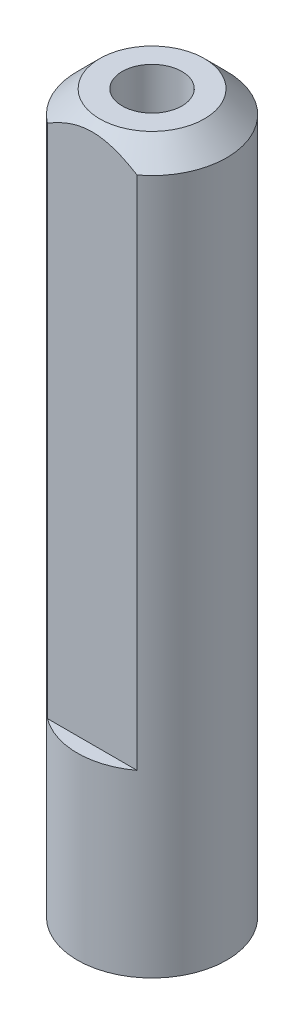
ISO-10303-21;
HEADER;
FILE_DESCRIPTION(('STEP AP214'),'2;1');
FILE_NAME('part.step','',(''),(''),'','','');
FILE_SCHEMA(('AUTOMOTIVE_DESIGN { 1 0 10303 214 1 1 1 1 }'));
ENDSEC;
DATA;
#1=APPLICATION_CONTEXT('core data for automotive mechanical design processes');
#2=APPLICATION_PROTOCOL_DEFINITION('international standard','automotive_design',2000,#1);
#3=PRODUCT_CONTEXT('',#1,'mechanical');
#4=PRODUCT('Part','Part','',(#3));
#5=PRODUCT_RELATED_PRODUCT_CATEGORY('part','',(#4));
#6=PRODUCT_DEFINITION_FORMATION('','',#4);
#7=PRODUCT_DEFINITION_CONTEXT('part definition',#1,'design');
#8=PRODUCT_DEFINITION('design','',#6,#7);
#9=PRODUCT_DEFINITION_SHAPE('','',#8);
#10=(LENGTH_UNIT() NAMED_UNIT(*) SI_UNIT(.MILLI.,.METRE.));
#11=(NAMED_UNIT(*) PLANE_ANGLE_UNIT() SI_UNIT($,.RADIAN.));
#12=(NAMED_UNIT(*) SI_UNIT($,.STERADIAN.) SOLID_ANGLE_UNIT());
#13=UNCERTAINTY_MEASURE_WITH_UNIT(LENGTH_MEASURE(1.E-05),#10,'distance_accuracy_value','');
#14=(GEOMETRIC_REPRESENTATION_CONTEXT(3) GLOBAL_UNCERTAINTY_ASSIGNED_CONTEXT((#13)) GLOBAL_UNIT_ASSIGNED_CONTEXT((#10,
#11,#12)) REPRESENTATION_CONTEXT('',''));
#15=CARTESIAN_POINT('',(0.,0.,0.));
#16=DIRECTION('',(0.,0.,1.));
#17=DIRECTION('',(1.,0.,0.));
#18=AXIS2_PLACEMENT_3D('',#15,#16,#17);
#19=CARTESIAN_POINT('',(0.,38.5,0.));
#20=DIRECTION('',(0.,-1.,0.));
#21=DIRECTION('',(-1.,0.,0.));
#22=AXIS2_PLACEMENT_3D('',#19,#20,#21);
#23=CYLINDRICAL_SURFACE('',#22,1.);
#24=CARTESIAN_POINT('',(0.,38.5,0.));
#25=DIRECTION('',(0.,-1.,0.));
#26=DIRECTION('',(-1.,0.,0.));
#27=AXIS2_PLACEMENT_3D('',#24,#25,#26);
#28=CIRCLE('',#27,1.);
#29=CARTESIAN_POINT('',(1.,38.5,0.));
#30=VERTEX_POINT('',#29);
#31=EDGE_CURVE('E115',#30,#30,#28,.T.);
#32=ORIENTED_EDGE('',*,*,#31,.F.);
#33=DIRECTION('',(0.,-1.,0.));
#34=VECTOR('',#33,1.);
#35=CARTESIAN_POINT('',(1.,38.5,0.));
#36=LINE('',#35,#34);
#37=CARTESIAN_POINT('',(1.,33.5,0.));
#38=VERTEX_POINT('',#37);
#39=EDGE_CURVE('E10',#30,#38,#36,.T.);
#40=ORIENTED_EDGE('',*,*,#39,.T.);
#41=CARTESIAN_POINT('',(0.,33.5,0.));
#42=DIRECTION('',(0.,-1.,0.));
#43=DIRECTION('',(-1.,0.,0.));
#44=AXIS2_PLACEMENT_3D('',#41,#42,#43);
#45=CIRCLE('',#44,1.);
#46=EDGE_CURVE('E19',#38,#38,#45,.T.);
#47=ORIENTED_EDGE('',*,*,#46,.T.);
#48=ORIENTED_EDGE('',*,*,#39,.F.);
#49=EDGE_LOOP('',(#32,#40,#47,#48));
#50=FACE_BOUND('',#49,.T.);
#51=ADVANCED_FACE('F16',(#50),#23,.F.);
#52=CARTESIAN_POINT('',(0.,33.5,0.));
#53=DIRECTION('',(0.,1.,0.));
#54=DIRECTION('',(1.,0.,0.));
#55=AXIS2_PLACEMENT_3D('',#52,#53,#54);
#56=PLANE('',#55);
#57=ORIENTED_EDGE('',*,*,#46,.F.);
#58=EDGE_LOOP('',(#57));
#59=FACE_BOUND('',#58,.T.);
#60=ADVANCED_FACE('F145',(#59),#56,.T.);
#61=CARTESIAN_POINT('',(-1.5,38.5,2.));
#62=DIRECTION('',(0.,0.,-1.));
#63=DIRECTION('',(0.,-1.,0.));
#64=AXIS2_PLACEMENT_3D('',#61,#62,#63);
#65=PLANE('',#64);
#66=CARTESIAN_POINT('',(-1.5,37.75,2.));
#67=CARTESIAN_POINT('',(0.,38.65,2.));
#68=CARTESIAN_POINT('',(1.5,37.75,2.));
#69=(BOUNDED_CURVE() B_SPLINE_CURVE(2,(#66,#67,#68),.UNSPECIFIED.,.F.,
.F.) B_SPLINE_CURVE_WITH_KNOTS((3,3),(0.,0.316227766016836),
.UNSPECIFIED.) CURVE() GEOMETRIC_REPRESENTATION_ITEM() RATIONAL_B_SPLINE_CURVE((1.,1.25,1.)) REPRESENTATION_ITEM(''));
#70=CARTESIAN_POINT('',(-1.5,37.75,2.));
#71=VERTEX_POINT('',#70);
#72=CARTESIAN_POINT('',(1.5,37.75,2.));
#73=VERTEX_POINT('',#72);
#74=EDGE_CURVE('E102',#71,#73,#69,.T.);
#75=ORIENTED_EDGE('',*,*,#74,.F.);
#76=DIRECTION('',(0.,1.,0.));
#77=VECTOR('',#76,1.);
#78=CARTESIAN_POINT('',(-1.5,16.5,2.));
#79=LINE('',#78,#77);
#80=CARTESIAN_POINT('',(-1.5,20.5,2.));
#81=VERTEX_POINT('',#80);
#82=EDGE_CURVE('E85',#81,#71,#79,.T.);
#83=ORIENTED_EDGE('',*,*,#82,.F.);
#84=DIRECTION('',(1.,0.,0.));
#85=VECTOR('',#84,1.);
#86=CARTESIAN_POINT('',(-1.5,20.5,2.));
#87=LINE('',#86,#85);
#88=CARTESIAN_POINT('',(1.5,20.5,2.));
#89=VERTEX_POINT('',#88);
#90=EDGE_CURVE('E43',#81,#89,#87,.T.);
#91=ORIENTED_EDGE('',*,*,#90,.T.);
#92=DIRECTION('',(0.,-1.,0.));
#93=VECTOR('',#92,1.);
#94=CARTESIAN_POINT('',(1.5,16.5,2.));
#95=LINE('',#94,#93);
#96=EDGE_CURVE('E98',#73,#89,#95,.T.);
#97=ORIENTED_EDGE('',*,*,#96,.F.);
#98=EDGE_LOOP('',(#75,#83,#91,#97));
#99=FACE_BOUND('',#98,.T.);
#100=ADVANCED_FACE('F134',(#99),#65,.F.);
#101=CARTESIAN_POINT('',(0.,20.5,2.25));
#102=DIRECTION('',(0.,1.,0.));
#103=DIRECTION('',(1.,0.,0.));
#104=AXIS2_PLACEMENT_3D('',#101,#102,#103);
#105=PLANE('',#104);
#106=CARTESIAN_POINT('',(0.,20.5,0.));
#107=DIRECTION('',(0.,-1.,0.));
#108=DIRECTION('',(-1.,0.,0.));
#109=AXIS2_PLACEMENT_3D('',#106,#107,#108);
#110=CIRCLE('',#109,2.5);
#111=EDGE_CURVE('E92',#89,#81,#110,.T.);
#112=ORIENTED_EDGE('',*,*,#111,.F.);
#113=ORIENTED_EDGE('',*,*,#90,.F.);
#114=EDGE_LOOP('',(#112,#113));
#115=FACE_BOUND('',#114,.T.);
#116=ADVANCED_FACE('F135',(#115),#105,.T.);
#117=CARTESIAN_POINT('',(0.,16.5,0.));
#118=DIRECTION('',(0.,1.,0.));
#119=DIRECTION('',(-1.,0.,0.));
#120=AXIS2_PLACEMENT_3D('',#117,#118,#119);
#121=CYLINDRICAL_SURFACE('',#120,2.5);
#122=ORIENTED_EDGE('',*,*,#96,.T.);
#123=ORIENTED_EDGE('',*,*,#111,.T.);
#124=ORIENTED_EDGE('',*,*,#82,.T.);
#125=CARTESIAN_POINT('',(0.,37.75,0.));
#126=DIRECTION('',(0.,1.,0.));
#127=DIRECTION('',(-1.,0.,0.));
#128=AXIS2_PLACEMENT_3D('',#125,#126,#127);
#129=CIRCLE('',#128,2.5);
#130=CARTESIAN_POINT('',(2.5,37.75,0.));
#131=VERTEX_POINT('',#130);
#132=EDGE_CURVE('E80',#131,#71,#129,.T.);
#133=ORIENTED_EDGE('',*,*,#132,.F.);
#134=DIRECTION('',(0.,-1.,0.));
#135=VECTOR('',#134,1.);
#136=CARTESIAN_POINT('',(2.5,16.5,0.));
#137=LINE('',#136,#135);
#138=CARTESIAN_POINT('',(2.5,14.5,0.));
#139=VERTEX_POINT('',#138);
#140=EDGE_CURVE('E74',#131,#139,#137,.T.);
#141=ORIENTED_EDGE('',*,*,#140,.T.);
#142=CARTESIAN_POINT('',(0.,14.5,0.));
#143=DIRECTION('',(0.,1.,0.));
#144=DIRECTION('',(-1.,0.,0.));
#145=AXIS2_PLACEMENT_3D('',#142,#143,#144);
#146=CIRCLE('',#145,2.5);
#147=EDGE_CURVE('E78',#139,#139,#146,.T.);
#148=ORIENTED_EDGE('',*,*,#147,.T.);
#149=ORIENTED_EDGE('',*,*,#140,.F.);
#150=CARTESIAN_POINT('',(0.,37.75,0.));
#151=DIRECTION('',(0.,1.,0.));
#152=DIRECTION('',(-1.,0.,0.));
#153=AXIS2_PLACEMENT_3D('',#150,#151,#152);
#154=CIRCLE('',#153,2.5);
#155=EDGE_CURVE('E99',#73,#131,#154,.T.);
#156=ORIENTED_EDGE('',*,*,#155,.F.);
#157=EDGE_LOOP('',(#122,#123,#124,#133,#141,#148,#149,#156));
#158=FACE_BOUND('',#157,.T.);
#159=ADVANCED_FACE('F76',(#158),#121,.T.);
#160=CARTESIAN_POINT('',(0.,38.125,0.));
#161=DIRECTION('',(0.,-1.,0.));
#162=DIRECTION('',(-1.,0.,0.));
#163=AXIS2_PLACEMENT_3D('',#160,#161,#162);
#164=CONICAL_SURFACE('',#163,2.125,0.785398163397447);
#165=CARTESIAN_POINT('',(0.,38.5,0.));
#166=DIRECTION('',(0.,-1.,0.));
#167=DIRECTION('',(-1.,0.,0.));
#168=AXIS2_PLACEMENT_3D('',#165,#166,#167);
#169=CIRCLE('',#168,1.75);
#170=CARTESIAN_POINT('',(1.75,38.5,0.));
#171=VERTEX_POINT('',#170);
#172=EDGE_CURVE('E117',#171,#171,#169,.T.);
#173=ORIENTED_EDGE('',*,*,#172,.T.);
#174=DIRECTION('',(0.707106781186547,-0.707106781186548,0.));
#175=VECTOR('',#174,1.);
#176=CARTESIAN_POINT('',(2.125,38.125,0.));
#177=LINE('',#176,#175);
#178=EDGE_CURVE('E110',#171,#131,#177,.T.);
#179=ORIENTED_EDGE('',*,*,#178,.T.);
#180=ORIENTED_EDGE('',*,*,#132,.T.);
#181=ORIENTED_EDGE('',*,*,#74,.T.);
#182=ORIENTED_EDGE('',*,*,#155,.T.);
#183=ORIENTED_EDGE('',*,*,#178,.F.);
#184=EDGE_LOOP('',(#173,#179,#180,#181,#182,#183));
#185=FACE_BOUND('',#184,.T.);
#186=ADVANCED_FACE('F130',(#185),#164,.T.);
#187=CARTESIAN_POINT('',(0.,38.5,0.));
#188=DIRECTION('',(0.,1.,0.));
#189=DIRECTION('',(1.,0.,0.));
#190=AXIS2_PLACEMENT_3D('',#187,#188,#189);
#191=PLANE('',#190);
#192=ORIENTED_EDGE('',*,*,#31,.T.);
#193=EDGE_LOOP('',(#192));
#194=FACE_BOUND('',#193,.T.);
#195=ORIENTED_EDGE('',*,*,#172,.F.);
#196=EDGE_LOOP('',(#195));
#197=FACE_BOUND('',#196,.T.);
#198=ADVANCED_FACE('F154',(#194,#197),#191,.T.);
#199=CARTESIAN_POINT('',(0.,14.5,0.));
#200=DIRECTION('',(0.,1.,0.));
#201=DIRECTION('',(1.,0.,0.));
#202=AXIS2_PLACEMENT_3D('',#199,#200,#201);
#203=PLANE('',#202);
#204=ORIENTED_EDGE('',*,*,#147,.F.);
#205=EDGE_LOOP('',(#204));
#206=FACE_BOUND('',#205,.T.);
#207=ADVANCED_FACE('F157',(#206),#203,.F.);
#208=CLOSED_SHELL('',(#51,#60,#100,#116,#159,#186,#198,#207));
#209=MANIFOLD_SOLID_BREP('B1',#208);
#210=ADVANCED_BREP_SHAPE_REPRESENTATION('',(#18,#209),#14);
#211=SHAPE_DEFINITION_REPRESENTATION(#9,#210);
ENDSEC;
END-ISO-10303-21;
